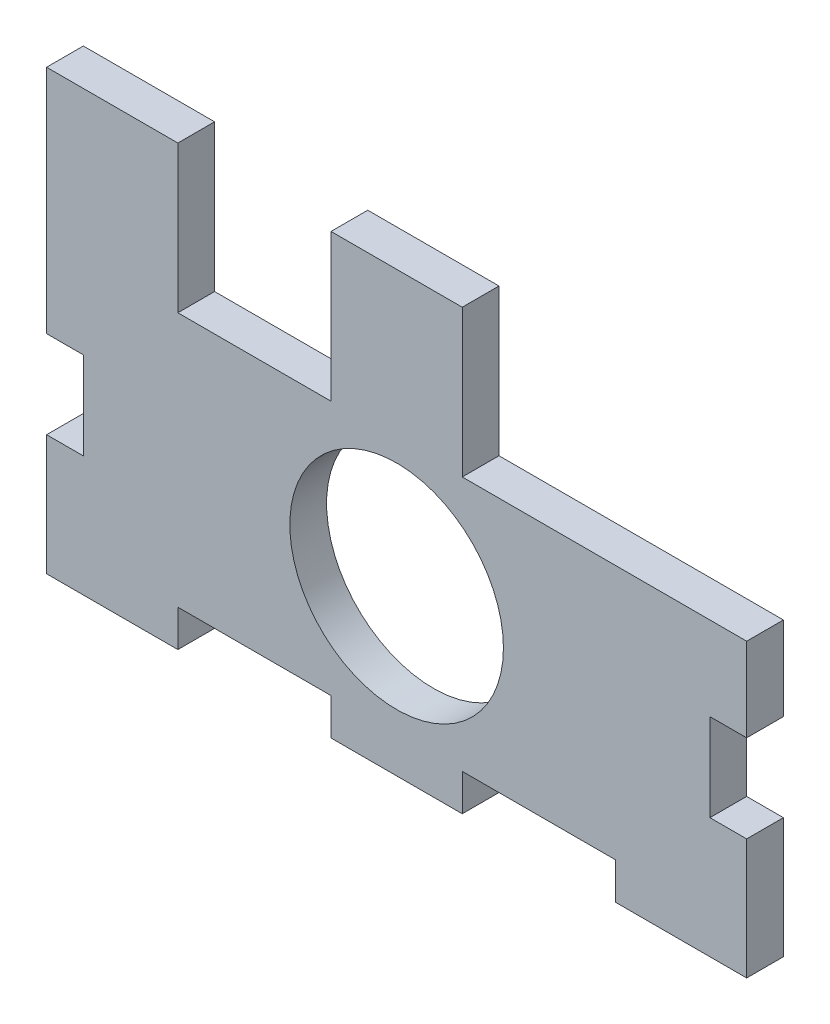
ISO-10303-21;
HEADER;
FILE_DESCRIPTION(('STEP AP214'),'2;1');
FILE_NAME('part.step','',(''),(''),'','','');
FILE_SCHEMA(('AUTOMOTIVE_DESIGN { 1 0 10303 214 1 1 1 1 }'));
ENDSEC;
DATA;
#1=APPLICATION_CONTEXT('core data for automotive mechanical design processes');
#2=APPLICATION_PROTOCOL_DEFINITION('international standard','automotive_design',2000,#1);
#3=PRODUCT_CONTEXT('',#1,'mechanical');
#4=PRODUCT('Part','Part','',(#3));
#5=PRODUCT_RELATED_PRODUCT_CATEGORY('part','',(#4));
#6=PRODUCT_DEFINITION_FORMATION('','',#4);
#7=PRODUCT_DEFINITION_CONTEXT('part definition',#1,'design');
#8=PRODUCT_DEFINITION('design','',#6,#7);
#9=PRODUCT_DEFINITION_SHAPE('','',#8);
#10=(LENGTH_UNIT() NAMED_UNIT(*) SI_UNIT(.MILLI.,.METRE.));
#11=(NAMED_UNIT(*) PLANE_ANGLE_UNIT() SI_UNIT($,.RADIAN.));
#12=(NAMED_UNIT(*) SI_UNIT($,.STERADIAN.) SOLID_ANGLE_UNIT());
#13=UNCERTAINTY_MEASURE_WITH_UNIT(LENGTH_MEASURE(1.E-05),#10,'distance_accuracy_value','');
#14=(GEOMETRIC_REPRESENTATION_CONTEXT(3) GLOBAL_UNCERTAINTY_ASSIGNED_CONTEXT((#13)) GLOBAL_UNIT_ASSIGNED_CONTEXT((#10,
#11,#12)) REPRESENTATION_CONTEXT('',''));
#15=CARTESIAN_POINT('',(0.,0.,0.));
#16=DIRECTION('',(0.,0.,1.));
#17=DIRECTION('',(1.,0.,0.));
#18=AXIS2_PLACEMENT_3D('',#15,#16,#17);
#19=CARTESIAN_POINT('',(-50.8,18.499999957,5.334));
#20=DIRECTION('',(0.,-1.,0.));
#21=DIRECTION('',(0.,0.,-1.));
#22=AXIS2_PLACEMENT_3D('',#19,#20,#21);
#23=PLANE('',#22);
#24=DIRECTION('',(0.,0.,-1.));
#25=VECTOR('',#24,1.);
#26=CARTESIAN_POINT('',(9.525,18.499999957,-6.59758706000879E-12));
#27=LINE('',#26,#25);
#28=CARTESIAN_POINT('',(9.525,18.499999957,5.334));
#29=VERTEX_POINT('',#28);
#30=CARTESIAN_POINT('',(9.525,18.499999957,0.));
#31=VERTEX_POINT('',#30);
#32=EDGE_CURVE('E58',#29,#31,#27,.T.);
#33=ORIENTED_EDGE('',*,*,#32,.F.);
#34=DIRECTION('',(-1.,0.,0.));
#35=VECTOR('',#34,1.);
#36=CARTESIAN_POINT('',(-50.8,18.499999957,5.334));
#37=LINE('',#36,#35);
#38=CARTESIAN_POINT('',(50.8,18.499999957,5.334));
#39=VERTEX_POINT('',#38);
#40=EDGE_CURVE('E259',#39,#29,#37,.T.);
#41=ORIENTED_EDGE('',*,*,#40,.F.);
#42=DIRECTION('',(0.,0.,-1.));
#43=VECTOR('',#42,1.);
#44=CARTESIAN_POINT('',(50.8,18.499999957,5.334));
#45=LINE('',#44,#43);
#46=CARTESIAN_POINT('',(50.8,18.499999957,0.));
#47=VERTEX_POINT('',#46);
#48=EDGE_CURVE('E295',#39,#47,#45,.T.);
#49=ORIENTED_EDGE('',*,*,#48,.T.);
#50=DIRECTION('',(-1.,0.,0.));
#51=VECTOR('',#50,1.);
#52=CARTESIAN_POINT('',(-50.8,18.499999957,0.));
#53=LINE('',#52,#51);
#54=EDGE_CURVE('E271',#47,#31,#53,.T.);
#55=ORIENTED_EDGE('',*,*,#54,.T.);
#56=EDGE_LOOP('',(#33,#41,#49,#55));
#57=FACE_BOUND('',#56,.T.);
#58=ADVANCED_FACE('F33',(#57),#23,.F.);
#59=DIRECTION('',(0.,0.,1.));
#60=VECTOR('',#59,1.);
#61=CARTESIAN_POINT('',(-9.525,18.499999957,-6.59758706000879E-12));
#62=LINE('',#61,#60);
#63=CARTESIAN_POINT('',(-9.525,18.499999957,-6.59758706000879E-12));
#64=VERTEX_POINT('',#63);
#65=CARTESIAN_POINT('',(-9.525,18.499999957,5.334));
#66=VERTEX_POINT('',#65);
#67=EDGE_CURVE('E231',#64,#66,#62,.T.);
#68=ORIENTED_EDGE('',*,*,#67,.F.);
#69=CARTESIAN_POINT('',(-31.75,18.499999957,0.));
#70=VERTEX_POINT('',#69);
#71=EDGE_CURVE('E269',#64,#70,#53,.T.);
#72=ORIENTED_EDGE('',*,*,#71,.T.);
#73=DIRECTION('',(0.,0.,-1.));
#74=VECTOR('',#73,1.);
#75=CARTESIAN_POINT('',(-31.75,18.499999957,0.));
#76=LINE('',#75,#74);
#77=CARTESIAN_POINT('',(-31.75,18.499999957,5.334));
#78=VERTEX_POINT('',#77);
#79=EDGE_CURVE('E234',#78,#70,#76,.T.);
#80=ORIENTED_EDGE('',*,*,#79,.F.);
#81=EDGE_CURVE('E37',#66,#78,#37,.T.);
#82=ORIENTED_EDGE('',*,*,#81,.F.);
#83=EDGE_LOOP('',(#68,#72,#80,#82));
#84=FACE_BOUND('',#83,.T.);
#85=ADVANCED_FACE('F405',(#84),#23,.F.);
#86=CARTESIAN_POINT('',(50.8,18.499999957,5.334));
#87=DIRECTION('',(-1.,0.,0.));
#88=DIRECTION('',(0.,-1.,0.));
#89=AXIS2_PLACEMENT_3D('',#86,#87,#88);
#90=PLANE('',#89);
#91=DIRECTION('',(0.,1.,0.));
#92=VECTOR('',#91,1.);
#93=CARTESIAN_POINT('',(50.8,18.499999957,0.));
#94=LINE('',#93,#92);
#95=CARTESIAN_POINT('',(50.8,-23.833999957,0.));
#96=VERTEX_POINT('',#95);
#97=CARTESIAN_POINT('',(50.8,-6.35,0.));
#98=VERTEX_POINT('',#97);
#99=EDGE_CURVE('E272',#96,#98,#94,.T.);
#100=ORIENTED_EDGE('',*,*,#99,.T.);
#101=DIRECTION('',(0.,0.,1.));
#102=VECTOR('',#101,1.);
#103=CARTESIAN_POINT('',(50.8,-6.35,5.334));
#104=LINE('',#103,#102);
#105=CARTESIAN_POINT('',(50.8,-6.35,5.334));
#106=VERTEX_POINT('',#105);
#107=EDGE_CURVE('E486',#98,#106,#104,.T.);
#108=ORIENTED_EDGE('',*,*,#107,.T.);
#109=DIRECTION('',(0.,1.,0.));
#110=VECTOR('',#109,1.);
#111=CARTESIAN_POINT('',(50.8,18.499999957,5.334));
#112=LINE('',#111,#110);
#113=CARTESIAN_POINT('',(50.8,-23.833999957,5.334));
#114=VERTEX_POINT('',#113);
#115=EDGE_CURVE('E333',#114,#106,#112,.T.);
#116=ORIENTED_EDGE('',*,*,#115,.F.);
#117=DIRECTION('',(0.,0.,1.));
#118=VECTOR('',#117,1.);
#119=CARTESIAN_POINT('',(50.8,-23.833999957,5.334));
#120=LINE('',#119,#118);
#121=EDGE_CURVE('E433',#96,#114,#120,.T.);
#122=ORIENTED_EDGE('',*,*,#121,.F.);
#123=EDGE_LOOP('',(#100,#108,#116,#122));
#124=FACE_BOUND('',#123,.T.);
#125=ADVANCED_FACE('F484',(#124),#90,.F.);
#126=CARTESIAN_POINT('',(-50.8,18.499999957,5.334));
#127=DIRECTION('',(1.,0.,0.));
#128=DIRECTION('',(0.,1.,0.));
#129=AXIS2_PLACEMENT_3D('',#126,#127,#128);
#130=PLANE('',#129);
#131=DIRECTION('',(0.,-1.,0.));
#132=VECTOR('',#131,1.);
#133=CARTESIAN_POINT('',(-50.8,18.499999957,5.334));
#134=LINE('',#133,#132);
#135=CARTESIAN_POINT('',(-50.8,-6.35,5.334));
#136=VERTEX_POINT('',#135);
#137=CARTESIAN_POINT('',(-50.8,-23.833999957,5.334));
#138=VERTEX_POINT('',#137);
#139=EDGE_CURVE('E385',#136,#138,#134,.T.);
#140=ORIENTED_EDGE('',*,*,#139,.F.);
#141=DIRECTION('',(0.,0.,-1.));
#142=VECTOR('',#141,1.);
#143=CARTESIAN_POINT('',(-50.8,-6.35,5.334));
#144=LINE('',#143,#142);
#145=CARTESIAN_POINT('',(-50.8,-6.35,0.));
#146=VERTEX_POINT('',#145);
#147=EDGE_CURVE('E361',#136,#146,#144,.T.);
#148=ORIENTED_EDGE('',*,*,#147,.T.);
#149=DIRECTION('',(0.,-1.,0.));
#150=VECTOR('',#149,1.);
#151=CARTESIAN_POINT('',(-50.8,18.499999957,0.));
#152=LINE('',#151,#150);
#153=CARTESIAN_POINT('',(-50.8,-23.833999957,0.));
#154=VERTEX_POINT('',#153);
#155=EDGE_CURVE('E280',#146,#154,#152,.T.);
#156=ORIENTED_EDGE('',*,*,#155,.T.);
#157=DIRECTION('',(0.,0.,-1.));
#158=VECTOR('',#157,1.);
#159=CARTESIAN_POINT('',(-50.8,-23.833999957,5.334));
#160=LINE('',#159,#158);
#161=EDGE_CURVE('E316',#138,#154,#160,.T.);
#162=ORIENTED_EDGE('',*,*,#161,.F.);
#163=EDGE_LOOP('',(#140,#148,#156,#162));
#164=FACE_BOUND('',#163,.T.);
#165=ADVANCED_FACE('F359',(#164),#130,.F.);
#166=CARTESIAN_POINT('',(-50.8,-18.499999957,5.334));
#167=DIRECTION('',(0.,1.,0.));
#168=DIRECTION('',(0.,0.,1.));
#169=AXIS2_PLACEMENT_3D('',#166,#167,#168);
#170=PLANE('',#169);
#171=DIRECTION('',(0.,0.,-1.));
#172=VECTOR('',#171,1.);
#173=CARTESIAN_POINT('',(31.75,-18.499999957,5.334));
#174=LINE('',#173,#172);
#175=CARTESIAN_POINT('',(31.75,-18.499999957,5.334));
#176=VERTEX_POINT('',#175);
#177=CARTESIAN_POINT('',(31.75,-18.499999957,0.));
#178=VERTEX_POINT('',#177);
#179=EDGE_CURVE('E419',#176,#178,#174,.T.);
#180=ORIENTED_EDGE('',*,*,#179,.F.);
#181=DIRECTION('',(1.,0.,0.));
#182=VECTOR('',#181,1.);
#183=CARTESIAN_POINT('',(-50.8,-18.499999957,5.334));
#184=LINE('',#183,#182);
#185=CARTESIAN_POINT('',(9.52500000000001,-18.499999957,5.334));
#186=VERTEX_POINT('',#185);
#187=EDGE_CURVE('E296',#186,#176,#184,.T.);
#188=ORIENTED_EDGE('',*,*,#187,.F.);
#189=DIRECTION('',(0.,0.,1.));
#190=VECTOR('',#189,1.);
#191=CARTESIAN_POINT('',(9.525,-18.499999957,5.33400183143679));
#192=LINE('',#191,#190);
#193=CARTESIAN_POINT('',(9.525,-18.499999957,0.));
#194=VERTEX_POINT('',#193);
#195=EDGE_CURVE('E443',#194,#186,#192,.T.);
#196=ORIENTED_EDGE('',*,*,#195,.F.);
#197=DIRECTION('',(1.,0.,0.));
#198=VECTOR('',#197,1.);
#199=CARTESIAN_POINT('',(-50.8,-18.499999957,0.));
#200=LINE('',#199,#198);
#201=EDGE_CURVE('E301',#194,#178,#200,.T.);
#202=ORIENTED_EDGE('',*,*,#201,.T.);
#203=EDGE_LOOP('',(#180,#188,#196,#202));
#204=FACE_BOUND('',#203,.T.);
#205=ADVANCED_FACE('F474',(#204),#170,.F.);
#206=DIRECTION('',(0.,0.,-1.));
#207=VECTOR('',#206,1.);
#208=CARTESIAN_POINT('',(-9.525,-18.499999957,5.33400183143679));
#209=LINE('',#208,#207);
#210=CARTESIAN_POINT('',(-9.52500000000001,-18.499999957,5.334));
#211=VERTEX_POINT('',#210);
#212=CARTESIAN_POINT('',(-9.52500000000001,-18.499999957,0.));
#213=VERTEX_POINT('',#212);
#214=EDGE_CURVE('E448',#211,#213,#209,.T.);
#215=ORIENTED_EDGE('',*,*,#214,.F.);
#216=CARTESIAN_POINT('',(-31.75,-18.499999957,5.334));
#217=VERTEX_POINT('',#216);
#218=EDGE_CURVE('E299',#217,#211,#184,.T.);
#219=ORIENTED_EDGE('',*,*,#218,.F.);
#220=DIRECTION('',(0.,0.,1.));
#221=VECTOR('',#220,1.);
#222=CARTESIAN_POINT('',(-31.75,-18.499999957,5.334));
#223=LINE('',#222,#221);
#224=CARTESIAN_POINT('',(-31.75,-18.499999957,0.));
#225=VERTEX_POINT('',#224);
#226=EDGE_CURVE('E312',#225,#217,#223,.T.);
#227=ORIENTED_EDGE('',*,*,#226,.F.);
#228=EDGE_CURVE('E310',#225,#213,#200,.T.);
#229=ORIENTED_EDGE('',*,*,#228,.T.);
#230=EDGE_LOOP('',(#215,#219,#227,#229));
#231=FACE_BOUND('',#230,.T.);
#232=ADVANCED_FACE('F525',(#231),#170,.F.);
#233=CARTESIAN_POINT('',(50.8,6.35,5.334));
#234=VERTEX_POINT('',#233);
#235=EDGE_CURVE('E335',#234,#39,#112,.T.);
#236=ORIENTED_EDGE('',*,*,#235,.F.);
#237=DIRECTION('',(0.,0.,-1.));
#238=VECTOR('',#237,1.);
#239=CARTESIAN_POINT('',(50.8,6.35,5.334));
#240=LINE('',#239,#238);
#241=CARTESIAN_POINT('',(50.8,6.35,0.));
#242=VERTEX_POINT('',#241);
#243=EDGE_CURVE('E489',#234,#242,#240,.T.);
#244=ORIENTED_EDGE('',*,*,#243,.T.);
#245=EDGE_CURVE('E328',#242,#47,#94,.T.);
#246=ORIENTED_EDGE('',*,*,#245,.T.);
#247=ORIENTED_EDGE('',*,*,#48,.F.);
#248=EDGE_LOOP('',(#236,#244,#246,#247));
#249=FACE_BOUND('',#248,.T.);
#250=ADVANCED_FACE('F35',(#249),#90,.F.);
#251=CARTESIAN_POINT('',(-50.8,39.835999957,0.));
#252=VERTEX_POINT('',#251);
#253=CARTESIAN_POINT('',(-50.8,6.35,0.));
#254=VERTEX_POINT('',#253);
#255=EDGE_CURVE('E277',#252,#254,#152,.T.);
#256=ORIENTED_EDGE('',*,*,#255,.T.);
#257=DIRECTION('',(0.,0.,1.));
#258=VECTOR('',#257,1.);
#259=CARTESIAN_POINT('',(-50.8,6.35,5.334));
#260=LINE('',#259,#258);
#261=CARTESIAN_POINT('',(-50.8,6.35,5.334));
#262=VERTEX_POINT('',#261);
#263=EDGE_CURVE('E415',#254,#262,#260,.T.);
#264=ORIENTED_EDGE('',*,*,#263,.T.);
#265=CARTESIAN_POINT('',(-50.8,39.835999957,5.334));
#266=VERTEX_POINT('',#265);
#267=EDGE_CURVE('E300',#266,#262,#134,.T.);
#268=ORIENTED_EDGE('',*,*,#267,.F.);
#269=DIRECTION('',(0.,0.,1.));
#270=VECTOR('',#269,1.);
#271=CARTESIAN_POINT('',(-50.8,39.835999957,0.));
#272=LINE('',#271,#270);
#273=EDGE_CURVE('E237',#252,#266,#272,.T.);
#274=ORIENTED_EDGE('',*,*,#273,.F.);
#275=EDGE_LOOP('',(#256,#264,#268,#274));
#276=FACE_BOUND('',#275,.T.);
#277=ADVANCED_FACE('F414',(#276),#130,.F.);
#278=CARTESIAN_POINT('',(0.,0.,5.334));
#279=DIRECTION('',(0.,0.,1.));
#280=DIRECTION('',(1.,0.,0.));
#281=AXIS2_PLACEMENT_3D('',#278,#279,#280);
#282=PLANE('',#281);
#283=DIRECTION('',(1.,0.,0.));
#284=VECTOR('',#283,1.);
#285=CARTESIAN_POINT('',(56.134,-6.35,5.334));
#286=LINE('',#285,#284);
#287=CARTESIAN_POINT('',(45.466,-6.35,5.334));
#288=VERTEX_POINT('',#287);
#289=EDGE_CURVE('E746',#288,#106,#286,.T.);
#290=ORIENTED_EDGE('',*,*,#289,.F.);
#291=DIRECTION('',(0.,-1.,0.));
#292=VECTOR('',#291,1.);
#293=CARTESIAN_POINT('',(45.466,6.35,5.334));
#294=LINE('',#293,#292);
#295=CARTESIAN_POINT('',(45.466,6.35,5.334));
#296=VERTEX_POINT('',#295);
#297=EDGE_CURVE('E748',#296,#288,#294,.T.);
#298=ORIENTED_EDGE('',*,*,#297,.F.);
#299=DIRECTION('',(-1.,0.,0.));
#300=VECTOR('',#299,1.);
#301=CARTESIAN_POINT('',(56.134,6.35,5.334));
#302=LINE('',#301,#300);
#303=EDGE_CURVE('E255',#234,#296,#302,.T.);
#304=ORIENTED_EDGE('',*,*,#303,.F.);
#305=ORIENTED_EDGE('',*,*,#235,.T.);
#306=ORIENTED_EDGE('',*,*,#40,.T.);
#307=DIRECTION('',(0.,-1.,0.));
#308=VECTOR('',#307,1.);
#309=CARTESIAN_POINT('',(9.525,39.835999957,5.334));
#310=LINE('',#309,#308);
#311=CARTESIAN_POINT('',(9.525,39.835999957,5.334));
#312=VERTEX_POINT('',#311);
#313=EDGE_CURVE('E390',#312,#29,#310,.T.);
#314=ORIENTED_EDGE('',*,*,#313,.F.);
#315=DIRECTION('',(1.,0.,0.));
#316=VECTOR('',#315,1.);
#317=CARTESIAN_POINT('',(-9.525,39.835999957,5.334));
#318=LINE('',#317,#316);
#319=CARTESIAN_POINT('',(-9.525,39.835999957,5.334));
#320=VERTEX_POINT('',#319);
#321=EDGE_CURVE('E227',#320,#312,#318,.T.);
#322=ORIENTED_EDGE('',*,*,#321,.F.);
#323=DIRECTION('',(0.,-1.,0.));
#324=VECTOR('',#323,1.);
#325=CARTESIAN_POINT('',(-9.525,39.835999957,5.334));
#326=LINE('',#325,#324);
#327=EDGE_CURVE('E239',#320,#66,#326,.T.);
#328=ORIENTED_EDGE('',*,*,#327,.T.);
#329=ORIENTED_EDGE('',*,*,#81,.T.);
#330=DIRECTION('',(0.,-1.,0.));
#331=VECTOR('',#330,1.);
#332=CARTESIAN_POINT('',(-31.75,39.835999957,5.334));
#333=LINE('',#332,#331);
#334=CARTESIAN_POINT('',(-31.75,39.835999957,5.334));
#335=VERTEX_POINT('',#334);
#336=EDGE_CURVE('E263',#335,#78,#333,.T.);
#337=ORIENTED_EDGE('',*,*,#336,.F.);
#338=DIRECTION('',(1.,0.,0.));
#339=VECTOR('',#338,1.);
#340=CARTESIAN_POINT('',(-50.8,39.835999957,5.334));
#341=LINE('',#340,#339);
#342=EDGE_CURVE('E245',#266,#335,#341,.T.);
#343=ORIENTED_EDGE('',*,*,#342,.F.);
#344=ORIENTED_EDGE('',*,*,#267,.T.);
#345=DIRECTION('',(-1.,0.,0.));
#346=VECTOR('',#345,1.);
#347=CARTESIAN_POINT('',(-56.134,6.35,5.334));
#348=LINE('',#347,#346);
#349=CARTESIAN_POINT('',(-45.466,6.35,5.334));
#350=VERTEX_POINT('',#349);
#351=EDGE_CURVE('E413',#350,#262,#348,.T.);
#352=ORIENTED_EDGE('',*,*,#351,.F.);
#353=DIRECTION('',(0.,1.,0.));
#354=VECTOR('',#353,1.);
#355=CARTESIAN_POINT('',(-45.466,6.35,5.334));
#356=LINE('',#355,#354);
#357=CARTESIAN_POINT('',(-45.466,-6.35,5.334));
#358=VERTEX_POINT('',#357);
#359=EDGE_CURVE('E488',#358,#350,#356,.T.);
#360=ORIENTED_EDGE('',*,*,#359,.F.);
#361=DIRECTION('',(1.,0.,0.));
#362=VECTOR('',#361,1.);
#363=CARTESIAN_POINT('',(-56.134,-6.35,5.334));
#364=LINE('',#363,#362);
#365=EDGE_CURVE('E388',#136,#358,#364,.T.);
#366=ORIENTED_EDGE('',*,*,#365,.F.);
#367=ORIENTED_EDGE('',*,*,#139,.T.);
#368=DIRECTION('',(-1.,0.,0.));
#369=VECTOR('',#368,1.);
#370=CARTESIAN_POINT('',(-50.8,-23.833999957,5.334));
#371=LINE('',#370,#369);
#372=CARTESIAN_POINT('',(-31.75,-23.833999957,5.334));
#373=VERTEX_POINT('',#372);
#374=EDGE_CURVE('E323',#373,#138,#371,.T.);
#375=ORIENTED_EDGE('',*,*,#374,.F.);
#376=DIRECTION('',(0.,1.,0.));
#377=VECTOR('',#376,1.);
#378=CARTESIAN_POINT('',(-31.75,-23.833999957,5.334));
#379=LINE('',#378,#377);
#380=EDGE_CURVE('E318',#373,#217,#379,.T.);
#381=ORIENTED_EDGE('',*,*,#380,.T.);
#382=ORIENTED_EDGE('',*,*,#218,.T.);
#383=DIRECTION('',(0.,1.,0.));
#384=VECTOR('',#383,1.);
#385=CARTESIAN_POINT('',(-9.525,-23.833999957,5.33400183143679));
#386=LINE('',#385,#384);
#387=CARTESIAN_POINT('',(-9.525,-23.833999957,5.33400183143679));
#388=VERTEX_POINT('',#387);
#389=EDGE_CURVE('E462',#388,#211,#386,.T.);
#390=ORIENTED_EDGE('',*,*,#389,.F.);
#391=DIRECTION('',(-1.,0.,0.));
#392=VECTOR('',#391,1.);
#393=CARTESIAN_POINT('',(-9.525,-23.833999957,5.33400183143679));
#394=LINE('',#393,#392);
#395=CARTESIAN_POINT('',(9.525,-23.833999957,5.33400183143679));
#396=VERTEX_POINT('',#395);
#397=EDGE_CURVE('E447',#396,#388,#394,.T.);
#398=ORIENTED_EDGE('',*,*,#397,.F.);
#399=DIRECTION('',(0.,1.,0.));
#400=VECTOR('',#399,1.);
#401=CARTESIAN_POINT('',(9.525,-23.833999957,5.33400183143679));
#402=LINE('',#401,#400);
#403=EDGE_CURVE('E317',#396,#186,#402,.T.);
#404=ORIENTED_EDGE('',*,*,#403,.T.);
#405=ORIENTED_EDGE('',*,*,#187,.T.);
#406=DIRECTION('',(0.,1.,0.));
#407=VECTOR('',#406,1.);
#408=CARTESIAN_POINT('',(31.75,-23.833999957,5.334));
#409=LINE('',#408,#407);
#410=CARTESIAN_POINT('',(31.75,-23.833999957,5.334));
#411=VERTEX_POINT('',#410);
#412=EDGE_CURVE('E440',#411,#176,#409,.T.);
#413=ORIENTED_EDGE('',*,*,#412,.F.);
#414=DIRECTION('',(-1.,0.,0.));
#415=VECTOR('',#414,1.);
#416=CARTESIAN_POINT('',(50.8,-23.833999957,5.334));
#417=LINE('',#416,#415);
#418=EDGE_CURVE('E425',#114,#411,#417,.T.);
#419=ORIENTED_EDGE('',*,*,#418,.F.);
#420=ORIENTED_EDGE('',*,*,#115,.T.);
#421=EDGE_LOOP('',(#290,#298,#304,#305,#306,#314,#322,#328,#329,#337,#343,#344,#352,#360,#366,
#367,#375,#381,#382,#390,#398,#404,#405,#413,#419,#420));
#422=FACE_BOUND('',#421,.T.);
#423=CARTESIAN_POINT('',(0.,0.,5.334));
#424=DIRECTION('',(0.,0.,1.));
#425=DIRECTION('',(1.,0.,0.));
#426=AXIS2_PLACEMENT_3D('',#423,#424,#425);
#427=CIRCLE('',#426,15.499999988);
#428=CARTESIAN_POINT('',(15.499999988,0.,5.334));
#429=VERTEX_POINT('',#428);
#430=EDGE_CURVE('E329',#429,#429,#427,.T.);
#431=ORIENTED_EDGE('',*,*,#430,.F.);
#432=EDGE_LOOP('',(#431));
#433=FACE_BOUND('',#432,.T.);
#434=ADVANCED_FACE('F382',(#422,#433),#282,.T.);
#435=CARTESIAN_POINT('',(0.,0.,0.));
#436=DIRECTION('',(0.,0.,1.));
#437=DIRECTION('',(1.,0.,0.));
#438=AXIS2_PLACEMENT_3D('',#435,#436,#437);
#439=PLANE('',#438);
#440=CARTESIAN_POINT('',(0.,0.,0.));
#441=DIRECTION('',(0.,0.,1.));
#442=DIRECTION('',(1.,0.,0.));
#443=AXIS2_PLACEMENT_3D('',#440,#441,#442);
#444=CIRCLE('',#443,15.499999988);
#445=CARTESIAN_POINT('',(15.499999988,0.,0.));
#446=VERTEX_POINT('',#445);
#447=EDGE_CURVE('E325',#446,#446,#444,.T.);
#448=ORIENTED_EDGE('',*,*,#447,.T.);
#449=EDGE_LOOP('',(#448));
#450=FACE_BOUND('',#449,.T.);
#451=DIRECTION('',(0.,-1.,0.));
#452=VECTOR('',#451,1.);
#453=CARTESIAN_POINT('',(45.466,0.,0.));
#454=LINE('',#453,#452);
#455=CARTESIAN_POINT('',(45.466,6.35,0.));
#456=VERTEX_POINT('',#455);
#457=CARTESIAN_POINT('',(45.466,-6.35,0.));
#458=VERTEX_POINT('',#457);
#459=EDGE_CURVE('E43',#456,#458,#454,.T.);
#460=ORIENTED_EDGE('',*,*,#459,.T.);
#461=DIRECTION('',(1.,0.,0.));
#462=VECTOR('',#461,1.);
#463=CARTESIAN_POINT('',(0.,-6.35,0.));
#464=LINE('',#463,#462);
#465=EDGE_CURVE('E11',#458,#98,#464,.T.);
#466=ORIENTED_EDGE('',*,*,#465,.T.);
#467=ORIENTED_EDGE('',*,*,#99,.F.);
#468=DIRECTION('',(1.,0.,0.));
#469=VECTOR('',#468,1.);
#470=CARTESIAN_POINT('',(50.8,-23.833999957,0.));
#471=LINE('',#470,#469);
#472=CARTESIAN_POINT('',(31.75,-23.833999957,0.));
#473=VERTEX_POINT('',#472);
#474=EDGE_CURVE('E430',#473,#96,#471,.T.);
#475=ORIENTED_EDGE('',*,*,#474,.F.);
#476=DIRECTION('',(0.,1.,0.));
#477=VECTOR('',#476,1.);
#478=CARTESIAN_POINT('',(31.75,-23.833999957,0.));
#479=LINE('',#478,#477);
#480=EDGE_CURVE('E436',#473,#178,#479,.T.);
#481=ORIENTED_EDGE('',*,*,#480,.T.);
#482=ORIENTED_EDGE('',*,*,#201,.F.);
#483=DIRECTION('',(0.,1.,0.));
#484=VECTOR('',#483,1.);
#485=CARTESIAN_POINT('',(9.525,-23.833999957,0.));
#486=LINE('',#485,#484);
#487=CARTESIAN_POINT('',(9.525,-23.833999957,0.));
#488=VERTEX_POINT('',#487);
#489=EDGE_CURVE('E454',#488,#194,#486,.T.);
#490=ORIENTED_EDGE('',*,*,#489,.F.);
#491=DIRECTION('',(1.,0.,0.));
#492=VECTOR('',#491,1.);
#493=CARTESIAN_POINT('',(-9.52500000000001,-23.833999957,0.));
#494=LINE('',#493,#492);
#495=CARTESIAN_POINT('',(-9.52500000000001,-23.833999957,0.));
#496=VERTEX_POINT('',#495);
#497=EDGE_CURVE('E452',#496,#488,#494,.T.);
#498=ORIENTED_EDGE('',*,*,#497,.F.);
#499=DIRECTION('',(0.,1.,0.));
#500=VECTOR('',#499,1.);
#501=CARTESIAN_POINT('',(-9.52500000000001,-23.833999957,0.));
#502=LINE('',#501,#500);
#503=EDGE_CURVE('E460',#496,#213,#502,.T.);
#504=ORIENTED_EDGE('',*,*,#503,.T.);
#505=ORIENTED_EDGE('',*,*,#228,.F.);
#506=DIRECTION('',(0.,1.,0.));
#507=VECTOR('',#506,1.);
#508=CARTESIAN_POINT('',(-31.75,-23.833999957,0.));
#509=LINE('',#508,#507);
#510=CARTESIAN_POINT('',(-31.75,-23.833999957,0.));
#511=VERTEX_POINT('',#510);
#512=EDGE_CURVE('E332',#511,#225,#509,.T.);
#513=ORIENTED_EDGE('',*,*,#512,.F.);
#514=DIRECTION('',(1.,0.,0.));
#515=VECTOR('',#514,1.);
#516=CARTESIAN_POINT('',(-50.8,-23.833999957,0.));
#517=LINE('',#516,#515);
#518=EDGE_CURVE('E363',#154,#511,#517,.T.);
#519=ORIENTED_EDGE('',*,*,#518,.F.);
#520=ORIENTED_EDGE('',*,*,#155,.F.);
#521=DIRECTION('',(1.,0.,0.));
#522=VECTOR('',#521,1.);
#523=CARTESIAN_POINT('',(0.,-6.35,0.));
#524=LINE('',#523,#522);
#525=CARTESIAN_POINT('',(-45.466,-6.35,0.));
#526=VERTEX_POINT('',#525);
#527=EDGE_CURVE('E286',#146,#526,#524,.T.);
#528=ORIENTED_EDGE('',*,*,#527,.T.);
#529=DIRECTION('',(0.,1.,0.));
#530=VECTOR('',#529,1.);
#531=CARTESIAN_POINT('',(-45.466,0.,0.));
#532=LINE('',#531,#530);
#533=CARTESIAN_POINT('',(-45.466,6.35,0.));
#534=VERTEX_POINT('',#533);
#535=EDGE_CURVE('E289',#526,#534,#532,.T.);
#536=ORIENTED_EDGE('',*,*,#535,.T.);
#537=DIRECTION('',(-1.,0.,0.));
#538=VECTOR('',#537,1.);
#539=CARTESIAN_POINT('',(0.,6.35,0.));
#540=LINE('',#539,#538);
#541=EDGE_CURVE('E292',#534,#254,#540,.T.);
#542=ORIENTED_EDGE('',*,*,#541,.T.);
#543=ORIENTED_EDGE('',*,*,#255,.F.);
#544=DIRECTION('',(-1.,0.,0.));
#545=VECTOR('',#544,1.);
#546=CARTESIAN_POINT('',(-50.8,39.835999957,0.));
#547=LINE('',#546,#545);
#548=CARTESIAN_POINT('',(-31.75,39.835999957,0.));
#549=VERTEX_POINT('',#548);
#550=EDGE_CURVE('E249',#549,#252,#547,.T.);
#551=ORIENTED_EDGE('',*,*,#550,.F.);
#552=DIRECTION('',(0.,-1.,0.));
#553=VECTOR('',#552,1.);
#554=CARTESIAN_POINT('',(-31.75,39.835999957,0.));
#555=LINE('',#554,#553);
#556=EDGE_CURVE('E252',#549,#70,#555,.T.);
#557=ORIENTED_EDGE('',*,*,#556,.T.);
#558=ORIENTED_EDGE('',*,*,#71,.F.);
#559=DIRECTION('',(0.,-1.,0.));
#560=VECTOR('',#559,1.);
#561=CARTESIAN_POINT('',(-9.525,39.835999957,-6.59758706000879E-12));
#562=LINE('',#561,#560);
#563=CARTESIAN_POINT('',(-9.525,39.835999957,-6.59758706000879E-12));
#564=VERTEX_POINT('',#563);
#565=EDGE_CURVE('E218',#564,#64,#562,.T.);
#566=ORIENTED_EDGE('',*,*,#565,.F.);
#567=DIRECTION('',(-1.,0.,0.));
#568=VECTOR('',#567,1.);
#569=CARTESIAN_POINT('',(-9.525,39.835999957,-6.59758706000879E-12));
#570=LINE('',#569,#568);
#571=CARTESIAN_POINT('',(9.525,39.835999957,-6.59758706000879E-12));
#572=VERTEX_POINT('',#571);
#573=EDGE_CURVE('E210',#572,#564,#570,.T.);
#574=ORIENTED_EDGE('',*,*,#573,.F.);
#575=DIRECTION('',(0.,-1.,0.));
#576=VECTOR('',#575,1.);
#577=CARTESIAN_POINT('',(9.525,39.835999957,-6.59758706000879E-12));
#578=LINE('',#577,#576);
#579=EDGE_CURVE('E216',#572,#31,#578,.T.);
#580=ORIENTED_EDGE('',*,*,#579,.T.);
#581=ORIENTED_EDGE('',*,*,#54,.F.);
#582=ORIENTED_EDGE('',*,*,#245,.F.);
#583=DIRECTION('',(-1.,0.,0.));
#584=VECTOR('',#583,1.);
#585=CARTESIAN_POINT('',(0.,6.35,0.));
#586=LINE('',#585,#584);
#587=EDGE_CURVE('E283',#242,#456,#586,.T.);
#588=ORIENTED_EDGE('',*,*,#587,.T.);
#589=EDGE_LOOP('',(#460,#466,#467,#475,#481,#482,#490,#498,#504,#505,#513,#519,#520,#528,#536,
#542,#543,#551,#557,#558,#566,#574,#580,#581,#582,#588));
#590=FACE_BOUND('',#589,.T.);
#591=ADVANCED_FACE('F213',(#450,#590),#439,.F.);
#592=CARTESIAN_POINT('',(0.,0.,0.));
#593=DIRECTION('',(0.,0.,1.));
#594=DIRECTION('',(1.,0.,0.));
#595=AXIS2_PLACEMENT_3D('',#592,#593,#594);
#596=CYLINDRICAL_SURFACE('',#595,15.499999988);
#597=ORIENTED_EDGE('',*,*,#447,.F.);
#598=EDGE_LOOP('',(#597));
#599=FACE_BOUND('',#598,.T.);
#600=ORIENTED_EDGE('',*,*,#430,.T.);
#601=EDGE_LOOP('',(#600));
#602=FACE_BOUND('',#601,.T.);
#603=ADVANCED_FACE('F528',(#599,#602),#596,.F.);
#604=CARTESIAN_POINT('',(-31.75,-23.833999957,5.334));
#605=DIRECTION('',(-1.,0.,0.));
#606=DIRECTION('',(0.,0.,1.));
#607=AXIS2_PLACEMENT_3D('',#604,#605,#606);
#608=PLANE('',#607);
#609=ORIENTED_EDGE('',*,*,#226,.T.);
#610=ORIENTED_EDGE('',*,*,#380,.F.);
#611=DIRECTION('',(0.,0.,1.));
#612=VECTOR('',#611,1.);
#613=CARTESIAN_POINT('',(-31.75,-23.833999957,5.334));
#614=LINE('',#613,#612);
#615=EDGE_CURVE('E367',#511,#373,#614,.T.);
#616=ORIENTED_EDGE('',*,*,#615,.F.);
#617=ORIENTED_EDGE('',*,*,#512,.T.);
#618=EDGE_LOOP('',(#609,#610,#616,#617));
#619=FACE_BOUND('',#618,.T.);
#620=ADVANCED_FACE('F381',(#619),#608,.F.);
#621=CARTESIAN_POINT('',(0.,-23.833999957,0.));
#622=DIRECTION('',(0.,-1.,0.));
#623=DIRECTION('',(0.,0.,-1.));
#624=AXIS2_PLACEMENT_3D('',#621,#622,#623);
#625=PLANE('',#624);
#626=ORIENTED_EDGE('',*,*,#161,.T.);
#627=ORIENTED_EDGE('',*,*,#518,.T.);
#628=ORIENTED_EDGE('',*,*,#615,.T.);
#629=ORIENTED_EDGE('',*,*,#374,.T.);
#630=EDGE_LOOP('',(#626,#627,#628,#629));
#631=FACE_BOUND('',#630,.T.);
#632=ADVANCED_FACE('F370',(#631),#625,.T.);
#633=CARTESIAN_POINT('',(9.525,-23.833999957,5.33400183143679));
#634=DIRECTION('',(-1.,0.,0.));
#635=DIRECTION('',(0.,0.,1.));
#636=AXIS2_PLACEMENT_3D('',#633,#634,#635);
#637=PLANE('',#636);
#638=ORIENTED_EDGE('',*,*,#195,.T.);
#639=ORIENTED_EDGE('',*,*,#403,.F.);
#640=DIRECTION('',(0.,0.,1.));
#641=VECTOR('',#640,1.);
#642=CARTESIAN_POINT('',(9.525,-23.833999957,5.33400183143679));
#643=LINE('',#642,#641);
#644=EDGE_CURVE('E444',#488,#396,#643,.T.);
#645=ORIENTED_EDGE('',*,*,#644,.F.);
#646=ORIENTED_EDGE('',*,*,#489,.T.);
#647=EDGE_LOOP('',(#638,#639,#645,#646));
#648=FACE_BOUND('',#647,.T.);
#649=ADVANCED_FACE('F472',(#648),#637,.F.);
#650=CARTESIAN_POINT('',(-9.525,-23.833999957,5.33400183143679));
#651=DIRECTION('',(1.,0.,0.));
#652=DIRECTION('',(0.,0.,-1.));
#653=AXIS2_PLACEMENT_3D('',#650,#651,#652);
#654=PLANE('',#653);
#655=ORIENTED_EDGE('',*,*,#214,.T.);
#656=ORIENTED_EDGE('',*,*,#503,.F.);
#657=DIRECTION('',(0.,0.,-1.));
#658=VECTOR('',#657,1.);
#659=CARTESIAN_POINT('',(-9.525,-23.833999957,5.33400183143679));
#660=LINE('',#659,#658);
#661=EDGE_CURVE('E450',#388,#496,#660,.T.);
#662=ORIENTED_EDGE('',*,*,#661,.F.);
#663=ORIENTED_EDGE('',*,*,#389,.T.);
#664=EDGE_LOOP('',(#655,#656,#662,#663));
#665=FACE_BOUND('',#664,.T.);
#666=ADVANCED_FACE('F541',(#665),#654,.F.);
#667=CARTESIAN_POINT('',(0.,-23.833999957,0.));
#668=DIRECTION('',(0.,-1.,0.));
#669=DIRECTION('',(0.,0.,-1.));
#670=AXIS2_PLACEMENT_3D('',#667,#668,#669);
#671=PLANE('',#670);
#672=ORIENTED_EDGE('',*,*,#644,.T.);
#673=ORIENTED_EDGE('',*,*,#397,.T.);
#674=ORIENTED_EDGE('',*,*,#661,.T.);
#675=ORIENTED_EDGE('',*,*,#497,.T.);
#676=EDGE_LOOP('',(#672,#673,#674,#675));
#677=FACE_BOUND('',#676,.T.);
#678=ADVANCED_FACE('F544',(#677),#671,.T.);
#679=CARTESIAN_POINT('',(31.75,-23.833999957,5.334));
#680=DIRECTION('',(1.,0.,0.));
#681=DIRECTION('',(0.,0.,-1.));
#682=AXIS2_PLACEMENT_3D('',#679,#680,#681);
#683=PLANE('',#682);
#684=ORIENTED_EDGE('',*,*,#179,.T.);
#685=ORIENTED_EDGE('',*,*,#480,.F.);
#686=DIRECTION('',(0.,0.,-1.));
#687=VECTOR('',#686,1.);
#688=CARTESIAN_POINT('',(31.75,-23.833999957,5.334));
#689=LINE('',#688,#687);
#690=EDGE_CURVE('E428',#411,#473,#689,.T.);
#691=ORIENTED_EDGE('',*,*,#690,.F.);
#692=ORIENTED_EDGE('',*,*,#412,.T.);
#693=EDGE_LOOP('',(#684,#685,#691,#692));
#694=FACE_BOUND('',#693,.T.);
#695=ADVANCED_FACE('F477',(#694),#683,.F.);
#696=CARTESIAN_POINT('',(0.,-23.833999957,0.));
#697=DIRECTION('',(0.,-1.,0.));
#698=DIRECTION('',(0.,0.,-1.));
#699=AXIS2_PLACEMENT_3D('',#696,#697,#698);
#700=PLANE('',#699);
#701=ORIENTED_EDGE('',*,*,#418,.T.);
#702=ORIENTED_EDGE('',*,*,#690,.T.);
#703=ORIENTED_EDGE('',*,*,#474,.T.);
#704=ORIENTED_EDGE('',*,*,#121,.T.);
#705=EDGE_LOOP('',(#701,#702,#703,#704));
#706=FACE_BOUND('',#705,.T.);
#707=ADVANCED_FACE('F482',(#706),#700,.T.);
#708=CARTESIAN_POINT('',(-45.466,6.35,-4.99999999997031E-05));
#709=DIRECTION('',(1.,0.,0.));
#710=DIRECTION('',(0.,0.,-1.));
#711=AXIS2_PLACEMENT_3D('',#708,#709,#710);
#712=PLANE('',#711);
#713=DIRECTION('',(0.,0.,1.));
#714=VECTOR('',#713,1.);
#715=CARTESIAN_POINT('',(-45.466,-6.35,-4.99999999997031E-05));
#716=LINE('',#715,#714);
#717=EDGE_CURVE('E417',#526,#358,#716,.T.);
#718=ORIENTED_EDGE('',*,*,#717,.T.);
#719=ORIENTED_EDGE('',*,*,#359,.T.);
#720=DIRECTION('',(0.,0.,1.));
#721=VECTOR('',#720,1.);
#722=CARTESIAN_POINT('',(-45.466,6.35,-4.99999999997031E-05));
#723=LINE('',#722,#721);
#724=EDGE_CURVE('E421',#534,#350,#723,.T.);
#725=ORIENTED_EDGE('',*,*,#724,.F.);
#726=ORIENTED_EDGE('',*,*,#535,.F.);
#727=EDGE_LOOP('',(#718,#719,#725,#726));
#728=FACE_BOUND('',#727,.T.);
#729=ADVANCED_FACE('F504',(#728),#712,.F.);
#730=CARTESIAN_POINT('',(-56.134,-6.35,-4.99999999997031E-05));
#731=DIRECTION('',(0.,-1.,0.));
#732=DIRECTION('',(0.,0.,-1.));
#733=AXIS2_PLACEMENT_3D('',#730,#731,#732);
#734=PLANE('',#733);
#735=ORIENTED_EDGE('',*,*,#365,.T.);
#736=ORIENTED_EDGE('',*,*,#717,.F.);
#737=ORIENTED_EDGE('',*,*,#527,.F.);
#738=ORIENTED_EDGE('',*,*,#147,.F.);
#739=EDGE_LOOP('',(#735,#736,#737,#738));
#740=FACE_BOUND('',#739,.T.);
#741=ADVANCED_FACE('F505',(#740),#734,.F.);
#742=CARTESIAN_POINT('',(-56.134,6.35,-4.99999999997031E-05));
#743=DIRECTION('',(0.,1.,0.));
#744=DIRECTION('',(0.,0.,1.));
#745=AXIS2_PLACEMENT_3D('',#742,#743,#744);
#746=PLANE('',#745);
#747=ORIENTED_EDGE('',*,*,#541,.F.);
#748=ORIENTED_EDGE('',*,*,#724,.T.);
#749=ORIENTED_EDGE('',*,*,#351,.T.);
#750=ORIENTED_EDGE('',*,*,#263,.F.);
#751=EDGE_LOOP('',(#747,#748,#749,#750));
#752=FACE_BOUND('',#751,.T.);
#753=ADVANCED_FACE('F502',(#752),#746,.F.);
#754=CARTESIAN_POINT('',(56.134,-6.35,-4.99999999997031E-05));
#755=DIRECTION('',(0.,-1.,0.));
#756=DIRECTION('',(0.,0.,-1.));
#757=AXIS2_PLACEMENT_3D('',#754,#755,#756);
#758=PLANE('',#757);
#759=ORIENTED_EDGE('',*,*,#465,.F.);
#760=DIRECTION('',(0.,0.,1.));
#761=VECTOR('',#760,1.);
#762=CARTESIAN_POINT('',(45.466,-6.35,-4.99999999997031E-05));
#763=LINE('',#762,#761);
#764=EDGE_CURVE('E494',#458,#288,#763,.T.);
#765=ORIENTED_EDGE('',*,*,#764,.T.);
#766=ORIENTED_EDGE('',*,*,#289,.T.);
#767=ORIENTED_EDGE('',*,*,#107,.F.);
#768=EDGE_LOOP('',(#759,#765,#766,#767));
#769=FACE_BOUND('',#768,.T.);
#770=ADVANCED_FACE('F512',(#769),#758,.F.);
#771=CARTESIAN_POINT('',(45.466,6.35,-4.99999999997031E-05));
#772=DIRECTION('',(-1.,0.,0.));
#773=DIRECTION('',(0.,0.,1.));
#774=AXIS2_PLACEMENT_3D('',#771,#772,#773);
#775=PLANE('',#774);
#776=DIRECTION('',(0.,0.,1.));
#777=VECTOR('',#776,1.);
#778=CARTESIAN_POINT('',(45.466,6.35,-4.99999999997031E-05));
#779=LINE('',#778,#777);
#780=EDGE_CURVE('E743',#456,#296,#779,.T.);
#781=ORIENTED_EDGE('',*,*,#780,.T.);
#782=ORIENTED_EDGE('',*,*,#297,.T.);
#783=ORIENTED_EDGE('',*,*,#764,.F.);
#784=ORIENTED_EDGE('',*,*,#459,.F.);
#785=EDGE_LOOP('',(#781,#782,#783,#784));
#786=FACE_BOUND('',#785,.T.);
#787=ADVANCED_FACE('F585',(#786),#775,.F.);
#788=CARTESIAN_POINT('',(56.134,6.35,-4.99999999997031E-05));
#789=DIRECTION('',(0.,1.,0.));
#790=DIRECTION('',(0.,0.,1.));
#791=AXIS2_PLACEMENT_3D('',#788,#789,#790);
#792=PLANE('',#791);
#793=ORIENTED_EDGE('',*,*,#303,.T.);
#794=ORIENTED_EDGE('',*,*,#780,.F.);
#795=ORIENTED_EDGE('',*,*,#587,.F.);
#796=ORIENTED_EDGE('',*,*,#243,.F.);
#797=EDGE_LOOP('',(#793,#794,#795,#796));
#798=FACE_BOUND('',#797,.T.);
#799=ADVANCED_FACE('F594',(#798),#792,.F.);
#800=CARTESIAN_POINT('',(-31.75,39.835999957,0.));
#801=DIRECTION('',(-1.,0.,0.));
#802=DIRECTION('',(0.,0.,1.));
#803=AXIS2_PLACEMENT_3D('',#800,#801,#802);
#804=PLANE('',#803);
#805=ORIENTED_EDGE('',*,*,#79,.T.);
#806=ORIENTED_EDGE('',*,*,#556,.F.);
#807=DIRECTION('',(0.,0.,-1.));
#808=VECTOR('',#807,1.);
#809=CARTESIAN_POINT('',(-31.75,39.835999957,0.));
#810=LINE('',#809,#808);
#811=EDGE_CURVE('E247',#335,#549,#810,.T.);
#812=ORIENTED_EDGE('',*,*,#811,.F.);
#813=ORIENTED_EDGE('',*,*,#336,.T.);
#814=EDGE_LOOP('',(#805,#806,#812,#813));
#815=FACE_BOUND('',#814,.T.);
#816=ADVANCED_FACE('F408',(#815),#804,.F.);
#817=CARTESIAN_POINT('',(0.,39.835999957,0.));
#818=DIRECTION('',(0.,1.,0.));
#819=DIRECTION('',(0.,0.,1.));
#820=AXIS2_PLACEMENT_3D('',#817,#818,#819);
#821=PLANE('',#820);
#822=ORIENTED_EDGE('',*,*,#273,.T.);
#823=ORIENTED_EDGE('',*,*,#342,.T.);
#824=ORIENTED_EDGE('',*,*,#811,.T.);
#825=ORIENTED_EDGE('',*,*,#550,.T.);
#826=EDGE_LOOP('',(#822,#823,#824,#825));
#827=FACE_BOUND('',#826,.T.);
#828=ADVANCED_FACE('F411',(#827),#821,.T.);
#829=CARTESIAN_POINT('',(9.525,39.835999957,-6.59758706000879E-12));
#830=DIRECTION('',(-1.,0.,0.));
#831=DIRECTION('',(0.,0.,1.));
#832=AXIS2_PLACEMENT_3D('',#829,#830,#831);
#833=PLANE('',#832);
#834=ORIENTED_EDGE('',*,*,#32,.T.);
#835=ORIENTED_EDGE('',*,*,#579,.F.);
#836=DIRECTION('',(0.,0.,-1.));
#837=VECTOR('',#836,1.);
#838=CARTESIAN_POINT('',(9.525,39.835999957,-6.59758706000879E-12));
#839=LINE('',#838,#837);
#840=EDGE_CURVE('E222',#312,#572,#839,.T.);
#841=ORIENTED_EDGE('',*,*,#840,.F.);
#842=ORIENTED_EDGE('',*,*,#313,.T.);
#843=EDGE_LOOP('',(#834,#835,#841,#842));
#844=FACE_BOUND('',#843,.T.);
#845=ADVANCED_FACE('F233',(#844),#833,.F.);
#846=CARTESIAN_POINT('',(-9.525,39.835999957,-6.59758706000879E-12));
#847=DIRECTION('',(1.,0.,0.));
#848=DIRECTION('',(0.,0.,-1.));
#849=AXIS2_PLACEMENT_3D('',#846,#847,#848);
#850=PLANE('',#849);
#851=ORIENTED_EDGE('',*,*,#67,.T.);
#852=ORIENTED_EDGE('',*,*,#327,.F.);
#853=DIRECTION('',(0.,0.,1.));
#854=VECTOR('',#853,1.);
#855=CARTESIAN_POINT('',(-9.525,39.835999957,-6.59758706000879E-12));
#856=LINE('',#855,#854);
#857=EDGE_CURVE('E221',#564,#320,#856,.T.);
#858=ORIENTED_EDGE('',*,*,#857,.F.);
#859=ORIENTED_EDGE('',*,*,#565,.T.);
#860=EDGE_LOOP('',(#851,#852,#858,#859));
#861=FACE_BOUND('',#860,.T.);
#862=ADVANCED_FACE('F401',(#861),#850,.F.);
#863=CARTESIAN_POINT('',(0.,39.835999957,0.));
#864=DIRECTION('',(0.,1.,0.));
#865=DIRECTION('',(0.,0.,1.));
#866=AXIS2_PLACEMENT_3D('',#863,#864,#865);
#867=PLANE('',#866);
#868=ORIENTED_EDGE('',*,*,#840,.T.);
#869=ORIENTED_EDGE('',*,*,#573,.T.);
#870=ORIENTED_EDGE('',*,*,#857,.T.);
#871=ORIENTED_EDGE('',*,*,#321,.T.);
#872=EDGE_LOOP('',(#868,#869,#870,#871));
#873=FACE_BOUND('',#872,.T.);
#874=ADVANCED_FACE('F225',(#873),#867,.T.);
#875=CLOSED_SHELL('',(#58,#85,#125,#165,#205,#232,#250,#277,#434,#591,#603,#620,#632,#649,#666,
#678,#695,#707,#729,#741,#753,#770,#787,#799,#816,#828,#845,#862,#874));
#876=MANIFOLD_SOLID_BREP('B2',#875);
#877=ADVANCED_BREP_SHAPE_REPRESENTATION('',(#18,#876),#14);
#878=SHAPE_DEFINITION_REPRESENTATION(#9,#877);
ENDSEC;
END-ISO-10303-21;
